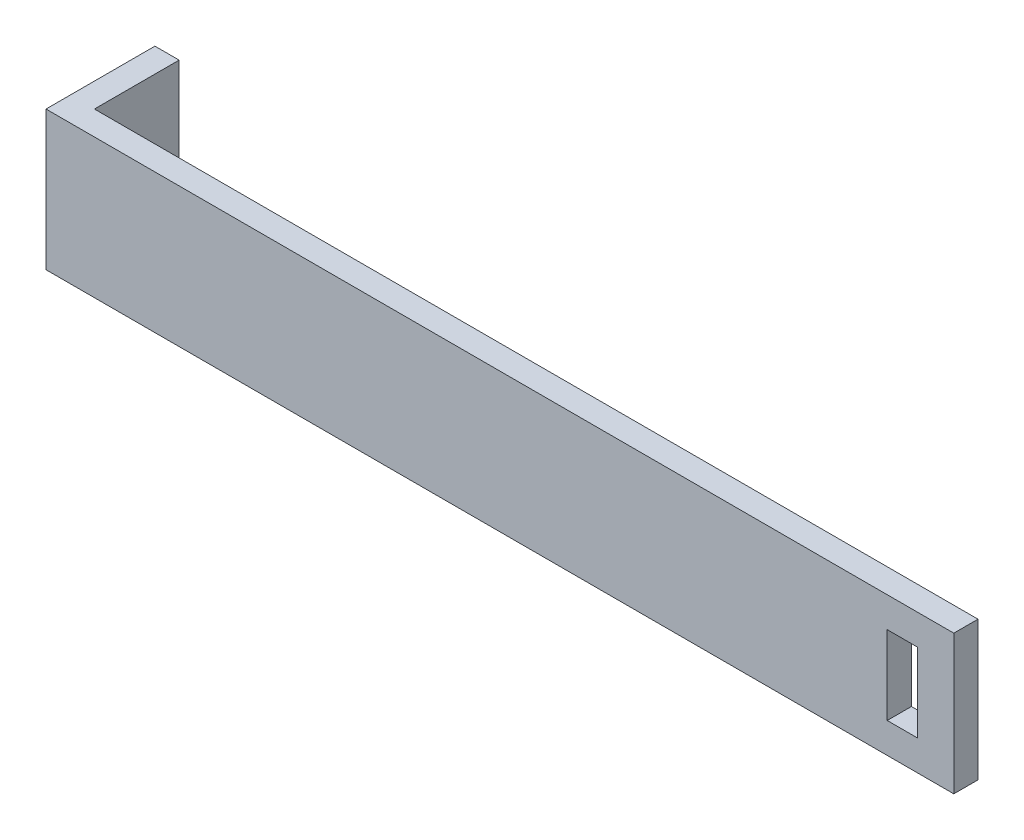
ISO-10303-21;
HEADER;
FILE_DESCRIPTION(('STEP AP214'),'2;1');
FILE_NAME('part.step','',(''),(''),'','','');
FILE_SCHEMA(('AUTOMOTIVE_DESIGN { 1 0 10303 214 1 1 1 1 }'));
ENDSEC;
DATA;
#1=APPLICATION_CONTEXT('core data for automotive mechanical design processes');
#2=APPLICATION_PROTOCOL_DEFINITION('international standard','automotive_design',2000,#1);
#3=PRODUCT_CONTEXT('',#1,'mechanical');
#4=PRODUCT('Part','Part','',(#3));
#5=PRODUCT_RELATED_PRODUCT_CATEGORY('part','',(#4));
#6=PRODUCT_DEFINITION_FORMATION('','',#4);
#7=PRODUCT_DEFINITION_CONTEXT('part definition',#1,'design');
#8=PRODUCT_DEFINITION('design','',#6,#7);
#9=PRODUCT_DEFINITION_SHAPE('','',#8);
#10=(LENGTH_UNIT() NAMED_UNIT(*) SI_UNIT(.MILLI.,.METRE.));
#11=(NAMED_UNIT(*) PLANE_ANGLE_UNIT() SI_UNIT($,.RADIAN.));
#12=(NAMED_UNIT(*) SI_UNIT($,.STERADIAN.) SOLID_ANGLE_UNIT());
#13=UNCERTAINTY_MEASURE_WITH_UNIT(LENGTH_MEASURE(1.E-05),#10,'distance_accuracy_value','');
#14=(GEOMETRIC_REPRESENTATION_CONTEXT(3) GLOBAL_UNCERTAINTY_ASSIGNED_CONTEXT((#13)) GLOBAL_UNIT_ASSIGNED_CONTEXT((#10,
#11,#12)) REPRESENTATION_CONTEXT('',''));
#15=CARTESIAN_POINT('',(0.,0.,0.));
#16=DIRECTION('',(0.,0.,1.));
#17=DIRECTION('',(1.,0.,0.));
#18=AXIS2_PLACEMENT_3D('',#15,#16,#17);
#19=CARTESIAN_POINT('',(0.,0.,0.));
#20=DIRECTION('',(0.,0.,1.));
#21=DIRECTION('',(1.,0.,0.));
#22=AXIS2_PLACEMENT_3D('',#19,#20,#21);
#23=PLANE('',#22);
#24=DIRECTION('',(-1.,0.,0.));
#25=VECTOR('',#24,1.);
#26=CARTESIAN_POINT('',(0.,43.495670995671,0.));
#27=LINE('',#26,#25);
#28=CARTESIAN_POINT('',(-17.8268398268398,43.495670995671,0.));
#29=VERTEX_POINT('',#28);
#30=CARTESIAN_POINT('',(-20.3268398268398,43.495670995671,0.));
#31=VERTEX_POINT('',#30);
#32=EDGE_CURVE('E146',#29,#31,#27,.T.);
#33=ORIENTED_EDGE('',*,*,#32,.T.);
#34=DIRECTION('',(0.,-1.,0.));
#35=VECTOR('',#34,1.);
#36=CARTESIAN_POINT('',(-20.3268398268398,0.,0.));
#37=LINE('',#36,#35);
#38=CARTESIAN_POINT('',(-20.3268398268398,36.995670995671,0.));
#39=VERTEX_POINT('',#38);
#40=EDGE_CURVE('E149',#31,#39,#37,.T.);
#41=ORIENTED_EDGE('',*,*,#40,.T.);
#42=DIRECTION('',(1.,0.,0.));
#43=VECTOR('',#42,1.);
#44=CARTESIAN_POINT('',(0.,36.995670995671,0.));
#45=LINE('',#44,#43);
#46=CARTESIAN_POINT('',(-17.8268398268398,36.995670995671,0.));
#47=VERTEX_POINT('',#46);
#48=EDGE_CURVE('E141',#39,#47,#45,.T.);
#49=ORIENTED_EDGE('',*,*,#48,.T.);
#50=DIRECTION('',(0.,1.,0.));
#51=VECTOR('',#50,1.);
#52=CARTESIAN_POINT('',(-17.8268398268398,0.,0.));
#53=LINE('',#52,#51);
#54=EDGE_CURVE('E121',#47,#29,#53,.T.);
#55=ORIENTED_EDGE('',*,*,#54,.T.);
#56=EDGE_LOOP('',(#33,#41,#49,#55));
#57=FACE_BOUND('',#56,.T.);
#58=DIRECTION('',(0.,-1.,0.));
#59=VECTOR('',#58,1.);
#60=CARTESIAN_POINT('',(-87.8268398268398,45.995670995671,0.));
#61=LINE('',#60,#59);
#62=CARTESIAN_POINT('',(-87.8268398268398,45.995670995671,0.));
#63=VERTEX_POINT('',#62);
#64=CARTESIAN_POINT('',(-87.8268398268398,34.495670995671,0.));
#65=VERTEX_POINT('',#64);
#66=EDGE_CURVE('E152',#63,#65,#61,.T.);
#67=ORIENTED_EDGE('',*,*,#66,.F.);
#68=DIRECTION('',(-1.,0.,0.));
#69=VECTOR('',#68,1.);
#70=CARTESIAN_POINT('',(-89.8268398268398,45.995670995671,0.));
#71=LINE('',#70,#69);
#72=CARTESIAN_POINT('',(-14.8268398268398,45.995670995671,0.));
#73=VERTEX_POINT('',#72);
#74=EDGE_CURVE('E176',#73,#63,#71,.T.);
#75=ORIENTED_EDGE('',*,*,#74,.F.);
#76=DIRECTION('',(0.,1.,0.));
#77=VECTOR('',#76,1.);
#78=CARTESIAN_POINT('',(-14.8268398268398,45.995670995671,0.));
#79=LINE('',#78,#77);
#80=CARTESIAN_POINT('',(-14.8268398268398,34.495670995671,0.));
#81=VERTEX_POINT('',#80);
#82=EDGE_CURVE('E184',#81,#73,#79,.T.);
#83=ORIENTED_EDGE('',*,*,#82,.F.);
#84=DIRECTION('',(1.,0.,0.));
#85=VECTOR('',#84,1.);
#86=CARTESIAN_POINT('',(-89.8268398268398,34.495670995671,0.));
#87=LINE('',#86,#85);
#88=EDGE_CURVE('E171',#65,#81,#87,.T.);
#89=ORIENTED_EDGE('',*,*,#88,.F.);
#90=EDGE_LOOP('',(#67,#75,#83,#89));
#91=FACE_BOUND('',#90,.T.);
#92=ADVANCED_FACE('F39',(#57,#91),#23,.F.);
#93=CARTESIAN_POINT('',(-89.8268398268398,45.995670995671,2.));
#94=DIRECTION('',(1.,0.,0.));
#95=DIRECTION('',(0.,1.,0.));
#96=AXIS2_PLACEMENT_3D('',#93,#94,#95);
#97=PLANE('',#96);
#98=DIRECTION('',(0.,0.,-1.));
#99=VECTOR('',#98,1.);
#100=CARTESIAN_POINT('',(-89.8268398268398,45.995670995671,2.));
#101=LINE('',#100,#99);
#102=CARTESIAN_POINT('',(-89.8268398268398,45.995670995671,2.));
#103=VERTEX_POINT('',#102);
#104=CARTESIAN_POINT('',(-89.8268398268398,45.995670995671,-7.));
#105=VERTEX_POINT('',#104);
#106=EDGE_CURVE('E182',#103,#105,#101,.T.);
#107=ORIENTED_EDGE('',*,*,#106,.T.);
#108=DIRECTION('',(0.,1.,0.));
#109=VECTOR('',#108,1.);
#110=CARTESIAN_POINT('',(-89.8268398268398,45.995670995671,-7.));
#111=LINE('',#110,#109);
#112=CARTESIAN_POINT('',(-89.8268398268398,34.495670995671,-7.));
#113=VERTEX_POINT('',#112);
#114=EDGE_CURVE('E153',#113,#105,#111,.T.);
#115=ORIENTED_EDGE('',*,*,#114,.F.);
#116=DIRECTION('',(0.,0.,-1.));
#117=VECTOR('',#116,1.);
#118=CARTESIAN_POINT('',(-89.8268398268398,34.495670995671,2.));
#119=LINE('',#118,#117);
#120=CARTESIAN_POINT('',(-89.8268398268398,34.495670995671,2.));
#121=VERTEX_POINT('',#120);
#122=EDGE_CURVE('E11',#121,#113,#119,.T.);
#123=ORIENTED_EDGE('',*,*,#122,.F.);
#124=DIRECTION('',(0.,-1.,0.));
#125=VECTOR('',#124,1.);
#126=CARTESIAN_POINT('',(-89.8268398268398,45.995670995671,2.));
#127=LINE('',#126,#125);
#128=EDGE_CURVE('E172',#103,#121,#127,.T.);
#129=ORIENTED_EDGE('',*,*,#128,.F.);
#130=EDGE_LOOP('',(#107,#115,#123,#129));
#131=FACE_BOUND('',#130,.T.);
#132=ADVANCED_FACE('F41',(#131),#97,.F.);
#133=CARTESIAN_POINT('',(-89.8268398268398,34.495670995671,2.));
#134=DIRECTION('',(0.,1.,0.));
#135=DIRECTION('',(0.,0.,1.));
#136=AXIS2_PLACEMENT_3D('',#133,#134,#135);
#137=PLANE('',#136);
#138=ORIENTED_EDGE('',*,*,#122,.T.);
#139=DIRECTION('',(-1.,0.,0.));
#140=VECTOR('',#139,1.);
#141=CARTESIAN_POINT('',(-89.8268398268398,34.495670995671,-7.));
#142=LINE('',#141,#140);
#143=CARTESIAN_POINT('',(-87.8268398268398,34.495670995671,-7.));
#144=VERTEX_POINT('',#143);
#145=EDGE_CURVE('E160',#144,#113,#142,.T.);
#146=ORIENTED_EDGE('',*,*,#145,.F.);
#147=DIRECTION('',(0.,0.,1.));
#148=VECTOR('',#147,1.);
#149=CARTESIAN_POINT('',(-87.8268398268398,34.495670995671,-7.));
#150=LINE('',#149,#148);
#151=EDGE_CURVE('E163',#144,#65,#150,.T.);
#152=ORIENTED_EDGE('',*,*,#151,.T.);
#153=ORIENTED_EDGE('',*,*,#88,.T.);
#154=DIRECTION('',(0.,0.,-1.));
#155=VECTOR('',#154,1.);
#156=CARTESIAN_POINT('',(-14.8268398268398,34.495670995671,2.));
#157=LINE('',#156,#155);
#158=CARTESIAN_POINT('',(-14.8268398268398,34.495670995671,2.));
#159=VERTEX_POINT('',#158);
#160=EDGE_CURVE('E47',#159,#81,#157,.T.);
#161=ORIENTED_EDGE('',*,*,#160,.F.);
#162=DIRECTION('',(1.,0.,0.));
#163=VECTOR('',#162,1.);
#164=CARTESIAN_POINT('',(-89.8268398268398,34.495670995671,2.));
#165=LINE('',#164,#163);
#166=EDGE_CURVE('E175',#121,#159,#165,.T.);
#167=ORIENTED_EDGE('',*,*,#166,.F.);
#168=EDGE_LOOP('',(#138,#146,#152,#153,#161,#167));
#169=FACE_BOUND('',#168,.T.);
#170=ADVANCED_FACE('F218',(#169),#137,.F.);
#171=CARTESIAN_POINT('',(-14.8268398268398,45.995670995671,2.));
#172=DIRECTION('',(-1.,0.,0.));
#173=DIRECTION('',(0.,0.,1.));
#174=AXIS2_PLACEMENT_3D('',#171,#172,#173);
#175=PLANE('',#174);
#176=ORIENTED_EDGE('',*,*,#82,.T.);
#177=DIRECTION('',(0.,0.,-1.));
#178=VECTOR('',#177,1.);
#179=CARTESIAN_POINT('',(-14.8268398268398,45.995670995671,2.));
#180=LINE('',#179,#178);
#181=CARTESIAN_POINT('',(-14.8268398268398,45.995670995671,2.));
#182=VERTEX_POINT('',#181);
#183=EDGE_CURVE('E189',#182,#73,#180,.T.);
#184=ORIENTED_EDGE('',*,*,#183,.F.);
#185=DIRECTION('',(0.,1.,0.));
#186=VECTOR('',#185,1.);
#187=CARTESIAN_POINT('',(-14.8268398268398,45.995670995671,2.));
#188=LINE('',#187,#186);
#189=EDGE_CURVE('E178',#159,#182,#188,.T.);
#190=ORIENTED_EDGE('',*,*,#189,.F.);
#191=ORIENTED_EDGE('',*,*,#160,.T.);
#192=EDGE_LOOP('',(#176,#184,#190,#191));
#193=FACE_BOUND('',#192,.T.);
#194=ADVANCED_FACE('F196',(#193),#175,.F.);
#195=CARTESIAN_POINT('',(-89.8268398268398,45.995670995671,2.));
#196=DIRECTION('',(0.,-1.,0.));
#197=DIRECTION('',(0.,0.,-1.));
#198=AXIS2_PLACEMENT_3D('',#195,#196,#197);
#199=PLANE('',#198);
#200=ORIENTED_EDGE('',*,*,#74,.T.);
#201=DIRECTION('',(0.,0.,1.));
#202=VECTOR('',#201,1.);
#203=CARTESIAN_POINT('',(-87.8268398268398,45.995670995671,-7.));
#204=LINE('',#203,#202);
#205=CARTESIAN_POINT('',(-87.8268398268398,45.995670995671,-7.));
#206=VERTEX_POINT('',#205);
#207=EDGE_CURVE('E168',#206,#63,#204,.T.);
#208=ORIENTED_EDGE('',*,*,#207,.F.);
#209=DIRECTION('',(1.,0.,0.));
#210=VECTOR('',#209,1.);
#211=CARTESIAN_POINT('',(-89.8268398268398,45.995670995671,-7.));
#212=LINE('',#211,#210);
#213=EDGE_CURVE('E156',#105,#206,#212,.T.);
#214=ORIENTED_EDGE('',*,*,#213,.F.);
#215=ORIENTED_EDGE('',*,*,#106,.F.);
#216=DIRECTION('',(-1.,0.,0.));
#217=VECTOR('',#216,1.);
#218=CARTESIAN_POINT('',(-89.8268398268398,45.995670995671,2.));
#219=LINE('',#218,#217);
#220=EDGE_CURVE('E180',#182,#103,#219,.T.);
#221=ORIENTED_EDGE('',*,*,#220,.F.);
#222=ORIENTED_EDGE('',*,*,#183,.T.);
#223=EDGE_LOOP('',(#200,#208,#214,#215,#221,#222));
#224=FACE_BOUND('',#223,.T.);
#225=ADVANCED_FACE('F203',(#224),#199,.F.);
#226=CARTESIAN_POINT('',(0.,0.,2.));
#227=DIRECTION('',(0.,0.,1.));
#228=DIRECTION('',(1.,0.,0.));
#229=AXIS2_PLACEMENT_3D('',#226,#227,#228);
#230=PLANE('',#229);
#231=DIRECTION('',(0.,-1.,0.));
#232=VECTOR('',#231,1.);
#233=CARTESIAN_POINT('',(-20.3268398268398,43.495670995671,2.));
#234=LINE('',#233,#232);
#235=CARTESIAN_POINT('',(-20.3268398268398,43.495670995671,2.));
#236=VERTEX_POINT('',#235);
#237=CARTESIAN_POINT('',(-20.3268398268398,36.995670995671,2.));
#238=VERTEX_POINT('',#237);
#239=EDGE_CURVE('E62',#236,#238,#234,.T.);
#240=ORIENTED_EDGE('',*,*,#239,.F.);
#241=DIRECTION('',(-1.,0.,0.));
#242=VECTOR('',#241,1.);
#243=CARTESIAN_POINT('',(-20.3268398268398,43.495670995671,2.));
#244=LINE('',#243,#242);
#245=CARTESIAN_POINT('',(-17.8268398268398,43.495670995671,2.));
#246=VERTEX_POINT('',#245);
#247=EDGE_CURVE('E134',#246,#236,#244,.T.);
#248=ORIENTED_EDGE('',*,*,#247,.F.);
#249=DIRECTION('',(0.,1.,0.));
#250=VECTOR('',#249,1.);
#251=CARTESIAN_POINT('',(-17.8268398268398,43.495670995671,2.));
#252=LINE('',#251,#250);
#253=CARTESIAN_POINT('',(-17.8268398268398,36.995670995671,2.));
#254=VERTEX_POINT('',#253);
#255=EDGE_CURVE('E118',#254,#246,#252,.T.);
#256=ORIENTED_EDGE('',*,*,#255,.F.);
#257=DIRECTION('',(1.,0.,0.));
#258=VECTOR('',#257,1.);
#259=CARTESIAN_POINT('',(-20.3268398268398,36.995670995671,2.));
#260=LINE('',#259,#258);
#261=EDGE_CURVE('E127',#238,#254,#260,.T.);
#262=ORIENTED_EDGE('',*,*,#261,.F.);
#263=EDGE_LOOP('',(#240,#248,#256,#262));
#264=FACE_BOUND('',#263,.T.);
#265=ORIENTED_EDGE('',*,*,#128,.T.);
#266=ORIENTED_EDGE('',*,*,#166,.T.);
#267=ORIENTED_EDGE('',*,*,#189,.T.);
#268=ORIENTED_EDGE('',*,*,#220,.T.);
#269=EDGE_LOOP('',(#265,#266,#267,#268));
#270=FACE_BOUND('',#269,.T.);
#271=ADVANCED_FACE('F131',(#264,#270),#230,.T.);
#272=CARTESIAN_POINT('',(-87.8268398268398,45.995670995671,-7.));
#273=DIRECTION('',(-1.,0.,0.));
#274=DIRECTION('',(0.,0.,1.));
#275=AXIS2_PLACEMENT_3D('',#272,#273,#274);
#276=PLANE('',#275);
#277=ORIENTED_EDGE('',*,*,#66,.T.);
#278=ORIENTED_EDGE('',*,*,#151,.F.);
#279=DIRECTION('',(0.,-1.,0.));
#280=VECTOR('',#279,1.);
#281=CARTESIAN_POINT('',(-87.8268398268398,45.995670995671,-7.));
#282=LINE('',#281,#280);
#283=EDGE_CURVE('E158',#206,#144,#282,.T.);
#284=ORIENTED_EDGE('',*,*,#283,.F.);
#285=ORIENTED_EDGE('',*,*,#207,.T.);
#286=EDGE_LOOP('',(#277,#278,#284,#285));
#287=FACE_BOUND('',#286,.T.);
#288=ADVANCED_FACE('F208',(#287),#276,.F.);
#289=CARTESIAN_POINT('',(0.,0.,-7.));
#290=DIRECTION('',(0.,0.,1.));
#291=DIRECTION('',(1.,0.,0.));
#292=AXIS2_PLACEMENT_3D('',#289,#290,#291);
#293=PLANE('',#292);
#294=ORIENTED_EDGE('',*,*,#114,.T.);
#295=ORIENTED_EDGE('',*,*,#213,.T.);
#296=ORIENTED_EDGE('',*,*,#283,.T.);
#297=ORIENTED_EDGE('',*,*,#145,.T.);
#298=EDGE_LOOP('',(#294,#295,#296,#297));
#299=FACE_BOUND('',#298,.T.);
#300=ADVANCED_FACE('F212',(#299),#293,.F.);
#301=CARTESIAN_POINT('',(-20.3268398268398,43.495670995671,-8.));
#302=DIRECTION('',(-1.,0.,0.));
#303=DIRECTION('',(0.,-1.,0.));
#304=AXIS2_PLACEMENT_3D('',#301,#302,#303);
#305=PLANE('',#304);
#306=DIRECTION('',(0.,0.,1.));
#307=VECTOR('',#306,1.);
#308=CARTESIAN_POINT('',(-20.3268398268398,43.495670995671,-8.));
#309=LINE('',#308,#307);
#310=EDGE_CURVE('E139',#31,#236,#309,.T.);
#311=ORIENTED_EDGE('',*,*,#310,.T.);
#312=ORIENTED_EDGE('',*,*,#239,.T.);
#313=DIRECTION('',(0.,0.,1.));
#314=VECTOR('',#313,1.);
#315=CARTESIAN_POINT('',(-20.3268398268398,36.995670995671,-8.));
#316=LINE('',#315,#314);
#317=EDGE_CURVE('E124',#39,#238,#316,.T.);
#318=ORIENTED_EDGE('',*,*,#317,.F.);
#319=ORIENTED_EDGE('',*,*,#40,.F.);
#320=EDGE_LOOP('',(#311,#312,#318,#319));
#321=FACE_BOUND('',#320,.T.);
#322=ADVANCED_FACE('F244',(#321),#305,.F.);
#323=CARTESIAN_POINT('',(-20.3268398268398,43.495670995671,-8.));
#324=DIRECTION('',(0.,1.,0.));
#325=DIRECTION('',(0.,0.,1.));
#326=AXIS2_PLACEMENT_3D('',#323,#324,#325);
#327=PLANE('',#326);
#328=DIRECTION('',(0.,0.,1.));
#329=VECTOR('',#328,1.);
#330=CARTESIAN_POINT('',(-17.8268398268398,43.495670995671,-8.));
#331=LINE('',#330,#329);
#332=EDGE_CURVE('E123',#29,#246,#331,.T.);
#333=ORIENTED_EDGE('',*,*,#332,.T.);
#334=ORIENTED_EDGE('',*,*,#247,.T.);
#335=ORIENTED_EDGE('',*,*,#310,.F.);
#336=ORIENTED_EDGE('',*,*,#32,.F.);
#337=EDGE_LOOP('',(#333,#334,#335,#336));
#338=FACE_BOUND('',#337,.T.);
#339=ADVANCED_FACE('F248',(#338),#327,.F.);
#340=CARTESIAN_POINT('',(-17.8268398268398,43.495670995671,-8.));
#341=DIRECTION('',(1.,0.,0.));
#342=DIRECTION('',(0.,0.,-1.));
#343=AXIS2_PLACEMENT_3D('',#340,#341,#342);
#344=PLANE('',#343);
#345=DIRECTION('',(0.,0.,1.));
#346=VECTOR('',#345,1.);
#347=CARTESIAN_POINT('',(-17.8268398268398,36.995670995671,-8.));
#348=LINE('',#347,#346);
#349=EDGE_CURVE('E54',#47,#254,#348,.T.);
#350=ORIENTED_EDGE('',*,*,#349,.T.);
#351=ORIENTED_EDGE('',*,*,#255,.T.);
#352=ORIENTED_EDGE('',*,*,#332,.F.);
#353=ORIENTED_EDGE('',*,*,#54,.F.);
#354=EDGE_LOOP('',(#350,#351,#352,#353));
#355=FACE_BOUND('',#354,.T.);
#356=ADVANCED_FACE('F115',(#355),#344,.F.);
#357=CARTESIAN_POINT('',(-20.3268398268398,36.995670995671,-8.));
#358=DIRECTION('',(0.,-1.,0.));
#359=DIRECTION('',(0.,0.,-1.));
#360=AXIS2_PLACEMENT_3D('',#357,#358,#359);
#361=PLANE('',#360);
#362=ORIENTED_EDGE('',*,*,#317,.T.);
#363=ORIENTED_EDGE('',*,*,#261,.T.);
#364=ORIENTED_EDGE('',*,*,#349,.F.);
#365=ORIENTED_EDGE('',*,*,#48,.F.);
#366=EDGE_LOOP('',(#362,#363,#364,#365));
#367=FACE_BOUND('',#366,.T.);
#368=ADVANCED_FACE('F128',(#367),#361,.F.);
#369=CLOSED_SHELL('',(#92,#132,#170,#194,#225,#271,#288,#300,#322,#339,#356,#368));
#370=MANIFOLD_SOLID_BREP('B2',#369);
#371=ADVANCED_BREP_SHAPE_REPRESENTATION('',(#18,#370),#14);
#372=SHAPE_DEFINITION_REPRESENTATION(#9,#371);
ENDSEC;
END-ISO-10303-21;
